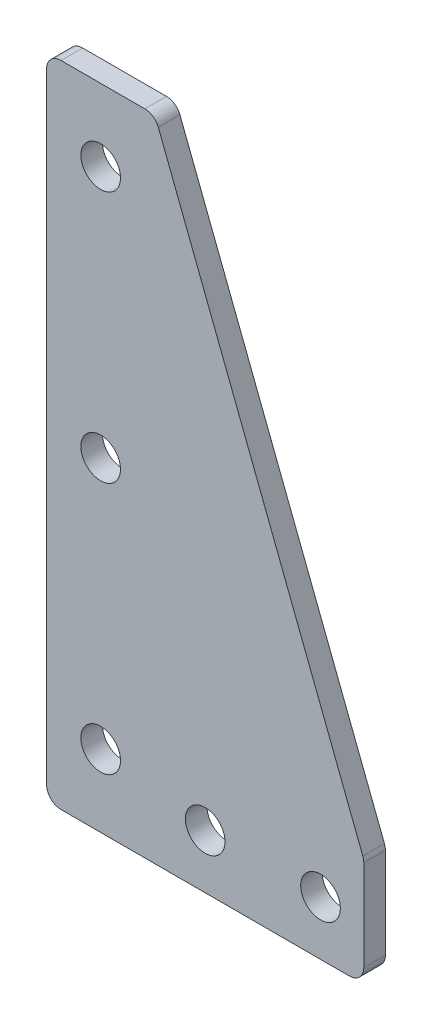
ISO-10303-21;
HEADER;
FILE_DESCRIPTION(('STEP AP214'),'2;1');
FILE_NAME('part.step','',(''),(''),'','','');
FILE_SCHEMA(('AUTOMOTIVE_DESIGN { 1 0 10303 214 1 1 1 1 }'));
ENDSEC;
DATA;
#1=APPLICATION_CONTEXT('core data for automotive mechanical design processes');
#2=APPLICATION_PROTOCOL_DEFINITION('international standard','automotive_design',2000,#1);
#3=PRODUCT_CONTEXT('',#1,'mechanical');
#4=PRODUCT('Part','Part','',(#3));
#5=PRODUCT_RELATED_PRODUCT_CATEGORY('part','',(#4));
#6=PRODUCT_DEFINITION_FORMATION('','',#4);
#7=PRODUCT_DEFINITION_CONTEXT('part definition',#1,'design');
#8=PRODUCT_DEFINITION('design','',#6,#7);
#9=PRODUCT_DEFINITION_SHAPE('','',#8);
#10=(LENGTH_UNIT() NAMED_UNIT(*) SI_UNIT(.MILLI.,.METRE.));
#11=(NAMED_UNIT(*) PLANE_ANGLE_UNIT() SI_UNIT($,.RADIAN.));
#12=(NAMED_UNIT(*) SI_UNIT($,.STERADIAN.) SOLID_ANGLE_UNIT());
#13=UNCERTAINTY_MEASURE_WITH_UNIT(LENGTH_MEASURE(1.E-05),#10,'distance_accuracy_value','');
#14=(GEOMETRIC_REPRESENTATION_CONTEXT(3) GLOBAL_UNCERTAINTY_ASSIGNED_CONTEXT((#13)) GLOBAL_UNIT_ASSIGNED_CONTEXT((#10,
#11,#12)) REPRESENTATION_CONTEXT('',''));
#15=CARTESIAN_POINT('',(0.,0.,0.));
#16=DIRECTION('',(0.,0.,1.));
#17=DIRECTION('',(1.,0.,0.));
#18=AXIS2_PLACEMENT_3D('',#15,#16,#17);
#19=CARTESIAN_POINT('',(0.,90.,3.));
#20=DIRECTION('',(1.,0.,0.));
#21=DIRECTION('',(0.,1.,0.));
#22=AXIS2_PLACEMENT_3D('',#19,#20,#21);
#23=PLANE('',#22);
#24=DIRECTION('',(0.,-1.,0.));
#25=VECTOR('',#24,1.);
#26=CARTESIAN_POINT('',(0.,90.,0.));
#27=LINE('',#26,#25);
#28=CARTESIAN_POINT('',(0.,88.,0.));
#29=VERTEX_POINT('',#28);
#30=CARTESIAN_POINT('',(0.,2.00000000000003,0.));
#31=VERTEX_POINT('',#30);
#32=EDGE_CURVE('E181',#29,#31,#27,.T.);
#33=ORIENTED_EDGE('',*,*,#32,.T.);
#34=DIRECTION('',(0.,0.,-1.));
#35=VECTOR('',#34,1.);
#36=CARTESIAN_POINT('',(0.,2.,3.));
#37=LINE('',#36,#35);
#38=CARTESIAN_POINT('',(0.,2.00000000000003,3.));
#39=VERTEX_POINT('',#38);
#40=EDGE_CURVE('E173',#31,#39,#37,.F.);
#41=ORIENTED_EDGE('',*,*,#40,.T.);
#42=DIRECTION('',(0.,-1.,0.));
#43=VECTOR('',#42,1.);
#44=CARTESIAN_POINT('',(0.,90.,3.));
#45=LINE('',#44,#43);
#46=CARTESIAN_POINT('',(0.,88.,3.));
#47=VERTEX_POINT('',#46);
#48=EDGE_CURVE('E140',#47,#39,#45,.T.);
#49=ORIENTED_EDGE('',*,*,#48,.F.);
#50=DIRECTION('',(0.,0.,-1.));
#51=VECTOR('',#50,1.);
#52=CARTESIAN_POINT('',(0.,88.,3.));
#53=LINE('',#52,#51);
#54=EDGE_CURVE('E170',#47,#29,#53,.T.);
#55=ORIENTED_EDGE('',*,*,#54,.T.);
#56=EDGE_LOOP('',(#33,#41,#49,#55));
#57=FACE_BOUND('',#56,.T.);
#58=ADVANCED_FACE('F33',(#57),#23,.F.);
#59=CARTESIAN_POINT('',(0.,0.,3.));
#60=DIRECTION('',(0.,1.,0.));
#61=DIRECTION('',(0.,0.,1.));
#62=AXIS2_PLACEMENT_3D('',#59,#60,#61);
#63=PLANE('',#62);
#64=DIRECTION('',(1.,0.,0.));
#65=VECTOR('',#64,1.);
#66=CARTESIAN_POINT('',(0.,0.,0.));
#67=LINE('',#66,#65);
#68=CARTESIAN_POINT('',(2.,0.,0.));
#69=VERTEX_POINT('',#68);
#70=CARTESIAN_POINT('',(42.,0.,0.));
#71=VERTEX_POINT('',#70);
#72=EDGE_CURVE('E142',#69,#71,#67,.T.);
#73=ORIENTED_EDGE('',*,*,#72,.T.);
#74=DIRECTION('',(0.,0.,-1.));
#75=VECTOR('',#74,1.);
#76=CARTESIAN_POINT('',(42.,0.,3.));
#77=LINE('',#76,#75);
#78=CARTESIAN_POINT('',(42.,0.,3.));
#79=VERTEX_POINT('',#78);
#80=EDGE_CURVE('E168',#71,#79,#77,.F.);
#81=ORIENTED_EDGE('',*,*,#80,.T.);
#82=DIRECTION('',(1.,0.,0.));
#83=VECTOR('',#82,1.);
#84=CARTESIAN_POINT('',(0.,0.,3.));
#85=LINE('',#84,#83);
#86=CARTESIAN_POINT('',(2.,0.,3.));
#87=VERTEX_POINT('',#86);
#88=EDGE_CURVE('E189',#87,#79,#85,.T.);
#89=ORIENTED_EDGE('',*,*,#88,.F.);
#90=DIRECTION('',(0.,0.,-1.));
#91=VECTOR('',#90,1.);
#92=CARTESIAN_POINT('',(2.,0.,3.));
#93=LINE('',#92,#91);
#94=EDGE_CURVE('E165',#87,#69,#93,.T.);
#95=ORIENTED_EDGE('',*,*,#94,.T.);
#96=EDGE_LOOP('',(#73,#81,#89,#95));
#97=FACE_BOUND('',#96,.T.);
#98=ADVANCED_FACE('F196',(#97),#63,.F.);
#99=CARTESIAN_POINT('',(44.,0.,3.));
#100=DIRECTION('',(-1.,0.,0.));
#101=DIRECTION('',(0.,0.,1.));
#102=AXIS2_PLACEMENT_3D('',#99,#100,#101);
#103=PLANE('',#102);
#104=DIRECTION('',(0.,1.,0.));
#105=VECTOR('',#104,1.);
#106=CARTESIAN_POINT('',(44.,0.,0.));
#107=LINE('',#106,#105);
#108=CARTESIAN_POINT('',(44.,2.,0.));
#109=VERTEX_POINT('',#108);
#110=CARTESIAN_POINT('',(44.,14.6267971053863,0.));
#111=VERTEX_POINT('',#110);
#112=EDGE_CURVE('E138',#109,#111,#107,.T.);
#113=ORIENTED_EDGE('',*,*,#112,.T.);
#114=DIRECTION('',(0.,0.,-1.));
#115=VECTOR('',#114,1.);
#116=CARTESIAN_POINT('',(44.,14.6267971053863,3.));
#117=LINE('',#116,#115);
#118=CARTESIAN_POINT('',(44.,14.6267971053863,3.));
#119=VERTEX_POINT('',#118);
#120=EDGE_CURVE('E116',#111,#119,#117,.F.);
#121=ORIENTED_EDGE('',*,*,#120,.T.);
#122=DIRECTION('',(0.,1.,0.));
#123=VECTOR('',#122,1.);
#124=CARTESIAN_POINT('',(44.,0.,3.));
#125=LINE('',#124,#123);
#126=CARTESIAN_POINT('',(44.,2.,3.));
#127=VERTEX_POINT('',#126);
#128=EDGE_CURVE('E203',#127,#119,#125,.T.);
#129=ORIENTED_EDGE('',*,*,#128,.F.);
#130=DIRECTION('',(0.,0.,-1.));
#131=VECTOR('',#130,1.);
#132=CARTESIAN_POINT('',(44.,2.,3.));
#133=LINE('',#132,#131);
#134=EDGE_CURVE('E121',#127,#109,#133,.T.);
#135=ORIENTED_EDGE('',*,*,#134,.T.);
#136=EDGE_LOOP('',(#113,#121,#129,#135));
#137=FACE_BOUND('',#136,.T.);
#138=ADVANCED_FACE('F258',(#137),#103,.F.);
#139=CARTESIAN_POINT('',(44.,15.,3.));
#140=DIRECTION('',(-0.932703085043673,-0.360645192883554,0.));
#141=DIRECTION('',(0.360645192883554,-0.932703085043673,0.));
#142=AXIS2_PLACEMENT_3D('',#139,#140,#141);
#143=PLANE('',#142);
#144=DIRECTION('',(-0.360645192883554,0.932703085043673,0.));
#145=VECTOR('',#144,1.);
#146=CARTESIAN_POINT('',(44.,15.,3.));
#147=LINE('',#146,#145);
#148=CARTESIAN_POINT('',(43.8654061700874,15.3480874911534,3.));
#149=VERTEX_POINT('',#148);
#150=CARTESIAN_POINT('',(15.4944343841701,88.7212903857671,3.));
#151=VERTEX_POINT('',#150);
#152=EDGE_CURVE('E130',#149,#151,#147,.T.);
#153=ORIENTED_EDGE('',*,*,#152,.F.);
#154=DIRECTION('',(0.,0.,-1.));
#155=VECTOR('',#154,1.);
#156=CARTESIAN_POINT('',(43.8654061700874,15.3480874911534,3.));
#157=LINE('',#156,#155);
#158=CARTESIAN_POINT('',(43.8654061700874,15.3480874911534,0.));
#159=VERTEX_POINT('',#158);
#160=EDGE_CURVE('E115',#149,#159,#157,.T.);
#161=ORIENTED_EDGE('',*,*,#160,.T.);
#162=DIRECTION('',(-0.360645192883554,0.932703085043673,0.));
#163=VECTOR('',#162,1.);
#164=CARTESIAN_POINT('',(44.,15.,0.));
#165=LINE('',#164,#163);
#166=CARTESIAN_POINT('',(15.4944343841701,88.7212903857671,0.));
#167=VERTEX_POINT('',#166);
#168=EDGE_CURVE('E128',#159,#167,#165,.T.);
#169=ORIENTED_EDGE('',*,*,#168,.T.);
#170=DIRECTION('',(0.,0.,-1.));
#171=VECTOR('',#170,1.);
#172=CARTESIAN_POINT('',(15.4944343841701,88.7212903857671,3.));
#173=LINE('',#172,#171);
#174=EDGE_CURVE('E132',#167,#151,#173,.F.);
#175=ORIENTED_EDGE('',*,*,#174,.T.);
#176=EDGE_LOOP('',(#153,#161,#169,#175));
#177=FACE_BOUND('',#176,.T.);
#178=ADVANCED_FACE('F127',(#177),#143,.F.);
#179=CARTESIAN_POINT('',(15.,90.,3.));
#180=DIRECTION('',(0.,-1.,0.));
#181=DIRECTION('',(0.,0.,-1.));
#182=AXIS2_PLACEMENT_3D('',#179,#180,#181);
#183=PLANE('',#182);
#184=DIRECTION('',(-1.,0.,0.));
#185=VECTOR('',#184,1.);
#186=CARTESIAN_POINT('',(15.,90.,3.));
#187=LINE('',#186,#185);
#188=CARTESIAN_POINT('',(13.6290282140827,90.,3.));
#189=VERTEX_POINT('',#188);
#190=CARTESIAN_POINT('',(2.,90.,3.));
#191=VERTEX_POINT('',#190);
#192=EDGE_CURVE('E146',#189,#191,#187,.T.);
#193=ORIENTED_EDGE('',*,*,#192,.F.);
#194=DIRECTION('',(0.,0.,-1.));
#195=VECTOR('',#194,1.);
#196=CARTESIAN_POINT('',(13.6290282140827,90.,3.));
#197=LINE('',#196,#195);
#198=CARTESIAN_POINT('',(13.6290282140827,90.,0.));
#199=VERTEX_POINT('',#198);
#200=EDGE_CURVE('E11',#189,#199,#197,.T.);
#201=ORIENTED_EDGE('',*,*,#200,.T.);
#202=DIRECTION('',(-1.,0.,0.));
#203=VECTOR('',#202,1.);
#204=CARTESIAN_POINT('',(15.,90.,0.));
#205=LINE('',#204,#203);
#206=CARTESIAN_POINT('',(2.,90.,0.));
#207=VERTEX_POINT('',#206);
#208=EDGE_CURVE('E137',#199,#207,#205,.T.);
#209=ORIENTED_EDGE('',*,*,#208,.T.);
#210=DIRECTION('',(0.,0.,-1.));
#211=VECTOR('',#210,1.);
#212=CARTESIAN_POINT('',(2.,90.,3.));
#213=LINE('',#212,#211);
#214=EDGE_CURVE('E41',#207,#191,#213,.F.);
#215=ORIENTED_EDGE('',*,*,#214,.T.);
#216=EDGE_LOOP('',(#193,#201,#209,#215));
#217=FACE_BOUND('',#216,.T.);
#218=ADVANCED_FACE('F277',(#217),#183,.F.);
#219=CARTESIAN_POINT('',(0.,0.,3.));
#220=DIRECTION('',(0.,0.,1.));
#221=DIRECTION('',(1.,0.,0.));
#222=AXIS2_PLACEMENT_3D('',#219,#220,#221);
#223=PLANE('',#222);
#224=CARTESIAN_POINT('',(7.5,9.99999999999999,3.));
#225=DIRECTION('',(0.,0.,1.));
#226=DIRECTION('',(1.,0.,0.));
#227=AXIS2_PLACEMENT_3D('',#224,#225,#226);
#228=CIRCLE('',#227,2.75);
#229=CARTESIAN_POINT('',(10.25,9.99999999999999,3.));
#230=VERTEX_POINT('',#229);
#231=EDGE_CURVE('E211',#230,#230,#228,.T.);
#232=ORIENTED_EDGE('',*,*,#231,.F.);
#233=EDGE_LOOP('',(#232));
#234=FACE_BOUND('',#233,.T.);
#235=CARTESIAN_POINT('',(38.,7.5,3.));
#236=DIRECTION('',(0.,0.,1.));
#237=DIRECTION('',(1.,0.,0.));
#238=AXIS2_PLACEMENT_3D('',#235,#236,#237);
#239=CIRCLE('',#238,2.75);
#240=CARTESIAN_POINT('',(40.75,7.5,3.));
#241=VERTEX_POINT('',#240);
#242=EDGE_CURVE('E214',#241,#241,#239,.T.);
#243=ORIENTED_EDGE('',*,*,#242,.F.);
#244=EDGE_LOOP('',(#243));
#245=FACE_BOUND('',#244,.T.);
#246=CARTESIAN_POINT('',(22.,7.5,3.));
#247=DIRECTION('',(0.,0.,1.));
#248=DIRECTION('',(1.,0.,0.));
#249=AXIS2_PLACEMENT_3D('',#246,#247,#248);
#250=CIRCLE('',#249,2.74999999999999);
#251=CARTESIAN_POINT('',(24.75,7.5,3.));
#252=VERTEX_POINT('',#251);
#253=EDGE_CURVE('E217',#252,#252,#250,.T.);
#254=ORIENTED_EDGE('',*,*,#253,.F.);
#255=EDGE_LOOP('',(#254));
#256=FACE_BOUND('',#255,.T.);
#257=CARTESIAN_POINT('',(7.5,80.,3.));
#258=DIRECTION('',(0.,0.,1.));
#259=DIRECTION('',(1.,0.,0.));
#260=AXIS2_PLACEMENT_3D('',#257,#258,#259);
#261=CIRCLE('',#260,2.75);
#262=CARTESIAN_POINT('',(10.25,80.,3.));
#263=VERTEX_POINT('',#262);
#264=EDGE_CURVE('E220',#263,#263,#261,.T.);
#265=ORIENTED_EDGE('',*,*,#264,.F.);
#266=EDGE_LOOP('',(#265));
#267=FACE_BOUND('',#266,.T.);
#268=CARTESIAN_POINT('',(7.5,45.,3.));
#269=DIRECTION('',(0.,0.,1.));
#270=DIRECTION('',(1.,0.,0.));
#271=AXIS2_PLACEMENT_3D('',#268,#269,#270);
#272=CIRCLE('',#271,2.75);
#273=CARTESIAN_POINT('',(10.25,45.,3.));
#274=VERTEX_POINT('',#273);
#275=EDGE_CURVE('E198',#274,#274,#272,.T.);
#276=ORIENTED_EDGE('',*,*,#275,.F.);
#277=EDGE_LOOP('',(#276));
#278=FACE_BOUND('',#277,.T.);
#279=ORIENTED_EDGE('',*,*,#128,.T.);
#280=CARTESIAN_POINT('',(42.,14.6267971053863,3.));
#281=DIRECTION('',(0.,0.,1.));
#282=DIRECTION('',(1.,0.,0.));
#283=AXIS2_PLACEMENT_3D('',#280,#281,#282);
#284=CIRCLE('',#283,2.);
#285=EDGE_CURVE('E163',#119,#149,#284,.T.);
#286=ORIENTED_EDGE('',*,*,#285,.T.);
#287=ORIENTED_EDGE('',*,*,#152,.T.);
#288=CARTESIAN_POINT('',(13.6290282140827,88.,3.));
#289=DIRECTION('',(0.,0.,1.));
#290=DIRECTION('',(1.,0.,0.));
#291=AXIS2_PLACEMENT_3D('',#288,#289,#290);
#292=CIRCLE('',#291,2.);
#293=EDGE_CURVE('E54',#151,#189,#292,.T.);
#294=ORIENTED_EDGE('',*,*,#293,.T.);
#295=ORIENTED_EDGE('',*,*,#192,.T.);
#296=CARTESIAN_POINT('',(2.,88.,3.));
#297=DIRECTION('',(0.,0.,1.));
#298=DIRECTION('',(1.,0.,0.));
#299=AXIS2_PLACEMENT_3D('',#296,#297,#298);
#300=CIRCLE('',#299,2.);
#301=EDGE_CURVE('E156',#191,#47,#300,.T.);
#302=ORIENTED_EDGE('',*,*,#301,.T.);
#303=ORIENTED_EDGE('',*,*,#48,.T.);
#304=CARTESIAN_POINT('',(2.,2.,3.));
#305=DIRECTION('',(0.,0.,1.));
#306=DIRECTION('',(1.,0.,0.));
#307=AXIS2_PLACEMENT_3D('',#304,#305,#306);
#308=CIRCLE('',#307,2.);
#309=EDGE_CURVE('E159',#39,#87,#308,.T.);
#310=ORIENTED_EDGE('',*,*,#309,.T.);
#311=ORIENTED_EDGE('',*,*,#88,.T.);
#312=CARTESIAN_POINT('',(42.,2.,3.));
#313=DIRECTION('',(0.,0.,1.));
#314=DIRECTION('',(1.,0.,0.));
#315=AXIS2_PLACEMENT_3D('',#312,#313,#314);
#316=CIRCLE('',#315,2.);
#317=EDGE_CURVE('E161',#79,#127,#316,.T.);
#318=ORIENTED_EDGE('',*,*,#317,.T.);
#319=EDGE_LOOP('',(#279,#286,#287,#294,#295,#302,#303,#310,#311,#318));
#320=FACE_BOUND('',#319,.T.);
#321=ADVANCED_FACE('F185',(#234,#245,#256,#267,#278,#320),#223,.T.);
#322=CARTESIAN_POINT('',(0.,0.,0.));
#323=DIRECTION('',(0.,0.,1.));
#324=DIRECTION('',(1.,0.,0.));
#325=AXIS2_PLACEMENT_3D('',#322,#323,#324);
#326=PLANE('',#325);
#327=CARTESIAN_POINT('',(7.5,9.99999999999999,0.));
#328=DIRECTION('',(0.,0.,1.));
#329=DIRECTION('',(-1.,0.,0.));
#330=AXIS2_PLACEMENT_3D('',#327,#328,#329);
#331=CIRCLE('',#330,2.75);
#332=CARTESIAN_POINT('',(4.75,9.99999999999999,0.));
#333=VERTEX_POINT('',#332);
#334=EDGE_CURVE('E230',#333,#333,#331,.T.);
#335=ORIENTED_EDGE('',*,*,#334,.T.);
#336=EDGE_LOOP('',(#335));
#337=FACE_BOUND('',#336,.T.);
#338=CARTESIAN_POINT('',(38.,7.5,0.));
#339=DIRECTION('',(0.,0.,1.));
#340=DIRECTION('',(-1.,0.,0.));
#341=AXIS2_PLACEMENT_3D('',#338,#339,#340);
#342=CIRCLE('',#341,2.75);
#343=CARTESIAN_POINT('',(35.25,7.5,0.));
#344=VERTEX_POINT('',#343);
#345=EDGE_CURVE('E227',#344,#344,#342,.T.);
#346=ORIENTED_EDGE('',*,*,#345,.T.);
#347=EDGE_LOOP('',(#346));
#348=FACE_BOUND('',#347,.T.);
#349=CARTESIAN_POINT('',(22.,7.5,0.));
#350=DIRECTION('',(0.,0.,1.));
#351=DIRECTION('',(1.,0.,0.));
#352=AXIS2_PLACEMENT_3D('',#349,#350,#351);
#353=CIRCLE('',#352,2.74999999999999);
#354=CARTESIAN_POINT('',(24.75,7.5,0.));
#355=VERTEX_POINT('',#354);
#356=EDGE_CURVE('E224',#355,#355,#353,.T.);
#357=ORIENTED_EDGE('',*,*,#356,.T.);
#358=EDGE_LOOP('',(#357));
#359=FACE_BOUND('',#358,.T.);
#360=CARTESIAN_POINT('',(7.5,80.,0.));
#361=DIRECTION('',(0.,0.,1.));
#362=DIRECTION('',(1.,0.,0.));
#363=AXIS2_PLACEMENT_3D('',#360,#361,#362);
#364=CIRCLE('',#363,2.75);
#365=CARTESIAN_POINT('',(10.25,80.,0.));
#366=VERTEX_POINT('',#365);
#367=EDGE_CURVE('E223',#366,#366,#364,.T.);
#368=ORIENTED_EDGE('',*,*,#367,.T.);
#369=EDGE_LOOP('',(#368));
#370=FACE_BOUND('',#369,.T.);
#371=CARTESIAN_POINT('',(7.5,45.,0.));
#372=DIRECTION('',(0.,0.,1.));
#373=DIRECTION('',(1.,0.,0.));
#374=AXIS2_PLACEMENT_3D('',#371,#372,#373);
#375=CIRCLE('',#374,2.75);
#376=CARTESIAN_POINT('',(10.25,45.,0.));
#377=VERTEX_POINT('',#376);
#378=EDGE_CURVE('E208',#377,#377,#375,.T.);
#379=ORIENTED_EDGE('',*,*,#378,.T.);
#380=EDGE_LOOP('',(#379));
#381=FACE_BOUND('',#380,.T.);
#382=ORIENTED_EDGE('',*,*,#168,.F.);
#383=CARTESIAN_POINT('',(42.,14.6267971053863,0.));
#384=DIRECTION('',(0.,0.,1.));
#385=DIRECTION('',(1.,0.,0.));
#386=AXIS2_PLACEMENT_3D('',#383,#384,#385);
#387=CIRCLE('',#386,2.);
#388=EDGE_CURVE('E111',#159,#111,#387,.F.);
#389=ORIENTED_EDGE('',*,*,#388,.T.);
#390=ORIENTED_EDGE('',*,*,#112,.F.);
#391=CARTESIAN_POINT('',(42.,2.,0.));
#392=DIRECTION('',(0.,0.,1.));
#393=DIRECTION('',(1.,0.,0.));
#394=AXIS2_PLACEMENT_3D('',#391,#392,#393);
#395=CIRCLE('',#394,2.);
#396=EDGE_CURVE('E122',#109,#71,#395,.F.);
#397=ORIENTED_EDGE('',*,*,#396,.T.);
#398=ORIENTED_EDGE('',*,*,#72,.F.);
#399=CARTESIAN_POINT('',(2.,2.,0.));
#400=DIRECTION('',(0.,0.,1.));
#401=DIRECTION('',(1.,0.,0.));
#402=AXIS2_PLACEMENT_3D('',#399,#400,#401);
#403=CIRCLE('',#402,2.);
#404=EDGE_CURVE('E150',#69,#31,#403,.F.);
#405=ORIENTED_EDGE('',*,*,#404,.T.);
#406=ORIENTED_EDGE('',*,*,#32,.F.);
#407=CARTESIAN_POINT('',(2.,88.,0.));
#408=DIRECTION('',(0.,0.,1.));
#409=DIRECTION('',(1.,0.,0.));
#410=AXIS2_PLACEMENT_3D('',#407,#408,#409);
#411=CIRCLE('',#410,2.);
#412=EDGE_CURVE('E131',#29,#207,#411,.F.);
#413=ORIENTED_EDGE('',*,*,#412,.T.);
#414=ORIENTED_EDGE('',*,*,#208,.F.);
#415=CARTESIAN_POINT('',(13.6290282140827,88.,0.));
#416=DIRECTION('',(0.,0.,1.));
#417=DIRECTION('',(1.,0.,0.));
#418=AXIS2_PLACEMENT_3D('',#415,#416,#417);
#419=CIRCLE('',#418,2.);
#420=EDGE_CURVE('E136',#199,#167,#419,.F.);
#421=ORIENTED_EDGE('',*,*,#420,.T.);
#422=EDGE_LOOP('',(#382,#389,#390,#397,#398,#405,#406,#413,#414,#421));
#423=FACE_BOUND('',#422,.T.);
#424=ADVANCED_FACE('F134',(#337,#348,#359,#370,#381,#423),#326,.F.);
#425=CARTESIAN_POINT('',(7.5,45.,0.));
#426=DIRECTION('',(0.,0.,1.));
#427=DIRECTION('',(1.,0.,0.));
#428=AXIS2_PLACEMENT_3D('',#425,#426,#427);
#429=CYLINDRICAL_SURFACE('',#428,2.75);
#430=ORIENTED_EDGE('',*,*,#275,.T.);
#431=EDGE_LOOP('',(#430));
#432=FACE_BOUND('',#431,.T.);
#433=ORIENTED_EDGE('',*,*,#378,.F.);
#434=EDGE_LOOP('',(#433));
#435=FACE_BOUND('',#434,.T.);
#436=ADVANCED_FACE('F320',(#432,#435),#429,.F.);
#437=CARTESIAN_POINT('',(7.5,80.,0.));
#438=DIRECTION('',(0.,0.,1.));
#439=DIRECTION('',(1.,0.,0.));
#440=AXIS2_PLACEMENT_3D('',#437,#438,#439);
#441=CYLINDRICAL_SURFACE('',#440,2.75);
#442=ORIENTED_EDGE('',*,*,#264,.T.);
#443=EDGE_LOOP('',(#442));
#444=FACE_BOUND('',#443,.T.);
#445=ORIENTED_EDGE('',*,*,#367,.F.);
#446=EDGE_LOOP('',(#445));
#447=FACE_BOUND('',#446,.T.);
#448=ADVANCED_FACE('F250',(#444,#447),#441,.F.);
#449=CARTESIAN_POINT('',(22.,7.5,0.));
#450=DIRECTION('',(0.,0.,1.));
#451=DIRECTION('',(1.,0.,0.));
#452=AXIS2_PLACEMENT_3D('',#449,#450,#451);
#453=CYLINDRICAL_SURFACE('',#452,2.74999999999999);
#454=ORIENTED_EDGE('',*,*,#253,.T.);
#455=EDGE_LOOP('',(#454));
#456=FACE_BOUND('',#455,.T.);
#457=ORIENTED_EDGE('',*,*,#356,.F.);
#458=EDGE_LOOP('',(#457));
#459=FACE_BOUND('',#458,.T.);
#460=ADVANCED_FACE('F241',(#456,#459),#453,.F.);
#461=CARTESIAN_POINT('',(38.,7.5,0.));
#462=DIRECTION('',(0.,0.,1.));
#463=DIRECTION('',(1.,0.,0.));
#464=AXIS2_PLACEMENT_3D('',#461,#462,#463);
#465=CYLINDRICAL_SURFACE('',#464,2.75);
#466=ORIENTED_EDGE('',*,*,#242,.T.);
#467=EDGE_LOOP('',(#466));
#468=FACE_BOUND('',#467,.T.);
#469=ORIENTED_EDGE('',*,*,#345,.F.);
#470=EDGE_LOOP('',(#469));
#471=FACE_BOUND('',#470,.T.);
#472=ADVANCED_FACE('F238',(#468,#471),#465,.F.);
#473=CARTESIAN_POINT('',(7.5,9.99999999999999,0.));
#474=DIRECTION('',(0.,0.,1.));
#475=DIRECTION('',(1.,0.,0.));
#476=AXIS2_PLACEMENT_3D('',#473,#474,#475);
#477=CYLINDRICAL_SURFACE('',#476,2.75);
#478=ORIENTED_EDGE('',*,*,#231,.T.);
#479=EDGE_LOOP('',(#478));
#480=FACE_BOUND('',#479,.T.);
#481=ORIENTED_EDGE('',*,*,#334,.F.);
#482=EDGE_LOOP('',(#481));
#483=FACE_BOUND('',#482,.T.);
#484=ADVANCED_FACE('F240',(#480,#483),#477,.F.);
#485=CARTESIAN_POINT('',(42.,14.6267971053863,3.));
#486=DIRECTION('',(0.,0.,-1.));
#487=DIRECTION('',(-1.,0.,0.));
#488=AXIS2_PLACEMENT_3D('',#485,#486,#487);
#489=CYLINDRICAL_SURFACE('',#488,2.);
#490=ORIENTED_EDGE('',*,*,#285,.F.);
#491=ORIENTED_EDGE('',*,*,#120,.F.);
#492=ORIENTED_EDGE('',*,*,#388,.F.);
#493=ORIENTED_EDGE('',*,*,#160,.F.);
#494=EDGE_LOOP('',(#490,#491,#492,#493));
#495=FACE_BOUND('',#494,.T.);
#496=ADVANCED_FACE('F114',(#495),#489,.T.);
#497=CARTESIAN_POINT('',(42.,2.,3.));
#498=DIRECTION('',(0.,0.,-1.));
#499=DIRECTION('',(-1.,0.,0.));
#500=AXIS2_PLACEMENT_3D('',#497,#498,#499);
#501=CYLINDRICAL_SURFACE('',#500,2.);
#502=ORIENTED_EDGE('',*,*,#317,.F.);
#503=ORIENTED_EDGE('',*,*,#80,.F.);
#504=ORIENTED_EDGE('',*,*,#396,.F.);
#505=ORIENTED_EDGE('',*,*,#134,.F.);
#506=EDGE_LOOP('',(#502,#503,#504,#505));
#507=FACE_BOUND('',#506,.T.);
#508=ADVANCED_FACE('F264',(#507),#501,.T.);
#509=CARTESIAN_POINT('',(2.,2.,3.));
#510=DIRECTION('',(0.,0.,-1.));
#511=DIRECTION('',(-1.,0.,0.));
#512=AXIS2_PLACEMENT_3D('',#509,#510,#511);
#513=CYLINDRICAL_SURFACE('',#512,2.);
#514=ORIENTED_EDGE('',*,*,#309,.F.);
#515=ORIENTED_EDGE('',*,*,#40,.F.);
#516=ORIENTED_EDGE('',*,*,#404,.F.);
#517=ORIENTED_EDGE('',*,*,#94,.F.);
#518=EDGE_LOOP('',(#514,#515,#516,#517));
#519=FACE_BOUND('',#518,.T.);
#520=ADVANCED_FACE('F192',(#519),#513,.T.);
#521=CARTESIAN_POINT('',(13.6290282140827,88.,3.));
#522=DIRECTION('',(0.,0.,-1.));
#523=DIRECTION('',(-1.,0.,0.));
#524=AXIS2_PLACEMENT_3D('',#521,#522,#523);
#525=CYLINDRICAL_SURFACE('',#524,2.);
#526=ORIENTED_EDGE('',*,*,#293,.F.);
#527=ORIENTED_EDGE('',*,*,#174,.F.);
#528=ORIENTED_EDGE('',*,*,#420,.F.);
#529=ORIENTED_EDGE('',*,*,#200,.F.);
#530=EDGE_LOOP('',(#526,#527,#528,#529));
#531=FACE_BOUND('',#530,.T.);
#532=ADVANCED_FACE('F269',(#531),#525,.T.);
#533=CARTESIAN_POINT('',(2.,88.,3.));
#534=DIRECTION('',(0.,0.,-1.));
#535=DIRECTION('',(-1.,0.,0.));
#536=AXIS2_PLACEMENT_3D('',#533,#534,#535);
#537=CYLINDRICAL_SURFACE('',#536,2.);
#538=ORIENTED_EDGE('',*,*,#301,.F.);
#539=ORIENTED_EDGE('',*,*,#214,.F.);
#540=ORIENTED_EDGE('',*,*,#412,.F.);
#541=ORIENTED_EDGE('',*,*,#54,.F.);
#542=EDGE_LOOP('',(#538,#539,#540,#541));
#543=FACE_BOUND('',#542,.T.);
#544=ADVANCED_FACE('F35',(#543),#537,.T.);
#545=CLOSED_SHELL('',(#58,#98,#138,#178,#218,#321,#424,#436,#448,#460,#472,#484,#496,#508,#520,
#532,#544));
#546=MANIFOLD_SOLID_BREP('B2',#545);
#547=ADVANCED_BREP_SHAPE_REPRESENTATION('',(#18,#546),#14);
#548=SHAPE_DEFINITION_REPRESENTATION(#9,#547);
ENDSEC;
END-ISO-10303-21;
